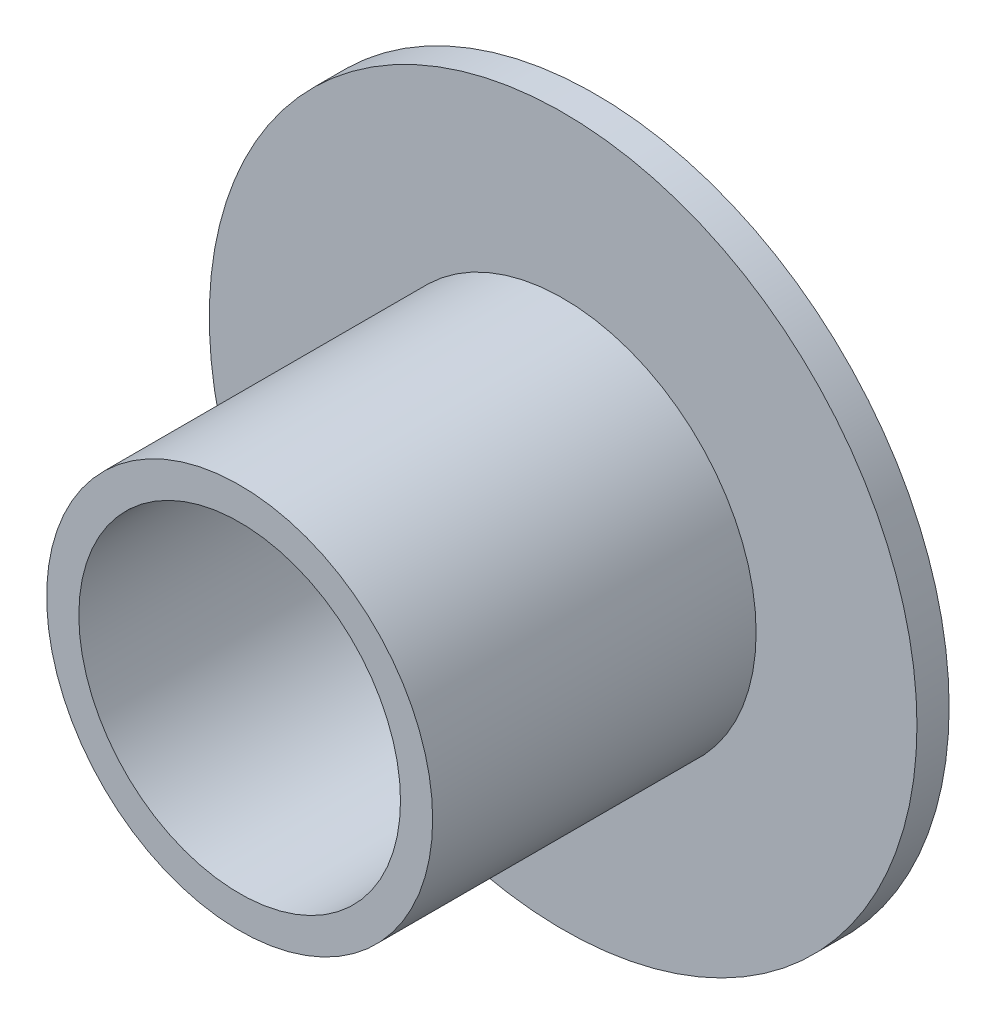
ISO-10303-21;
HEADER;
FILE_DESCRIPTION(('STEP AP214'),'2;1');
FILE_NAME('part.step','',(''),(''),'','','');
FILE_SCHEMA(('AUTOMOTIVE_DESIGN { 1 0 10303 214 1 1 1 1 }'));
ENDSEC;
DATA;
#1=APPLICATION_CONTEXT('core data for automotive mechanical design processes');
#2=APPLICATION_PROTOCOL_DEFINITION('international standard','automotive_design',2000,#1);
#3=PRODUCT_CONTEXT('',#1,'mechanical');
#4=PRODUCT('Part','Part','',(#3));
#5=PRODUCT_RELATED_PRODUCT_CATEGORY('part','',(#4));
#6=PRODUCT_DEFINITION_FORMATION('','',#4);
#7=PRODUCT_DEFINITION_CONTEXT('part definition',#1,'design');
#8=PRODUCT_DEFINITION('design','',#6,#7);
#9=PRODUCT_DEFINITION_SHAPE('','',#8);
#10=(LENGTH_UNIT() NAMED_UNIT(*) SI_UNIT(.MILLI.,.METRE.));
#11=(NAMED_UNIT(*) PLANE_ANGLE_UNIT() SI_UNIT($,.RADIAN.));
#12=(NAMED_UNIT(*) SI_UNIT($,.STERADIAN.) SOLID_ANGLE_UNIT());
#13=UNCERTAINTY_MEASURE_WITH_UNIT(LENGTH_MEASURE(1.E-05),#10,'distance_accuracy_value','');
#14=(GEOMETRIC_REPRESENTATION_CONTEXT(3) GLOBAL_UNCERTAINTY_ASSIGNED_CONTEXT((#13)) GLOBAL_UNIT_ASSIGNED_CONTEXT((#10,
#11,#12)) REPRESENTATION_CONTEXT('',''));
#15=CARTESIAN_POINT('',(0.,0.,0.));
#16=DIRECTION('',(0.,0.,1.));
#17=DIRECTION('',(1.,0.,0.));
#18=AXIS2_PLACEMENT_3D('',#15,#16,#17);
#19=CARTESIAN_POINT('',(0.,0.,0.));
#20=DIRECTION('',(0.,0.,1.));
#21=DIRECTION('',(1.,0.,0.));
#22=AXIS2_PLACEMENT_3D('',#19,#20,#21);
#23=PLANE('',#22);
#24=CARTESIAN_POINT('',(0.,0.,0.));
#25=DIRECTION('',(0.,0.,1.));
#26=DIRECTION('',(1.,0.,0.));
#27=AXIS2_PLACEMENT_3D('',#24,#25,#26);
#28=CIRCLE('',#27,110.);
#29=CARTESIAN_POINT('',(110.,0.,0.));
#30=VERTEX_POINT('',#29);
#31=EDGE_CURVE('E10',#30,#30,#28,.T.);
#32=ORIENTED_EDGE('',*,*,#31,.T.);
#33=EDGE_LOOP('',(#32));
#34=FACE_BOUND('',#33,.T.);
#35=CARTESIAN_POINT('',(0.,0.,0.));
#36=DIRECTION('',(0.,0.,1.));
#37=DIRECTION('',(1.,0.,0.));
#38=AXIS2_PLACEMENT_3D('',#35,#36,#37);
#39=CIRCLE('',#38,60.);
#40=CARTESIAN_POINT('',(60.,0.,0.));
#41=VERTEX_POINT('',#40);
#42=EDGE_CURVE('E55',#41,#41,#39,.T.);
#43=ORIENTED_EDGE('',*,*,#42,.F.);
#44=EDGE_LOOP('',(#43));
#45=FACE_BOUND('',#44,.T.);
#46=ADVANCED_FACE('F39',(#34,#45),#23,.T.);
#47=CARTESIAN_POINT('',(0.,0.,-10.));
#48=DIRECTION('',(0.,0.,1.));
#49=DIRECTION('',(1.,0.,0.));
#50=AXIS2_PLACEMENT_3D('',#47,#48,#49);
#51=PLANE('',#50);
#52=CARTESIAN_POINT('',(0.,0.,-10.));
#53=DIRECTION('',(0.,0.,1.));
#54=DIRECTION('',(1.,0.,0.));
#55=AXIS2_PLACEMENT_3D('',#52,#53,#54);
#56=CIRCLE('',#55,110.);
#57=CARTESIAN_POINT('',(110.,0.,-10.));
#58=VERTEX_POINT('',#57);
#59=EDGE_CURVE('E43',#58,#58,#56,.T.);
#60=ORIENTED_EDGE('',*,*,#59,.F.);
#61=EDGE_LOOP('',(#60));
#62=FACE_BOUND('',#61,.T.);
#63=CARTESIAN_POINT('',(0.,0.,-10.));
#64=DIRECTION('',(0.,0.,1.));
#65=DIRECTION('',(1.,0.,0.));
#66=AXIS2_PLACEMENT_3D('',#63,#64,#65);
#67=CIRCLE('',#66,50.);
#68=CARTESIAN_POINT('',(50.,0.,-10.));
#69=VERTEX_POINT('',#68);
#70=EDGE_CURVE('E50',#69,#69,#67,.T.);
#71=ORIENTED_EDGE('',*,*,#70,.T.);
#72=EDGE_LOOP('',(#71));
#73=FACE_BOUND('',#72,.T.);
#74=ADVANCED_FACE('F81',(#62,#73),#51,.F.);
#75=CARTESIAN_POINT('',(0.,0.,0.));
#76=DIRECTION('',(0.,0.,-1.));
#77=DIRECTION('',(-1.,0.,0.));
#78=AXIS2_PLACEMENT_3D('',#75,#76,#77);
#79=CYLINDRICAL_SURFACE('',#78,110.);
#80=ORIENTED_EDGE('',*,*,#31,.F.);
#81=EDGE_LOOP('',(#80));
#82=FACE_BOUND('',#81,.T.);
#83=ORIENTED_EDGE('',*,*,#59,.T.);
#84=EDGE_LOOP('',(#83));
#85=FACE_BOUND('',#84,.T.);
#86=ADVANCED_FACE('F41',(#82,#85),#79,.T.);
#87=CARTESIAN_POINT('',(0.,0.,0.));
#88=DIRECTION('',(0.,0.,-1.));
#89=DIRECTION('',(-1.,0.,0.));
#90=AXIS2_PLACEMENT_3D('',#87,#88,#89);
#91=CYLINDRICAL_SURFACE('',#90,50.);
#92=ORIENTED_EDGE('',*,*,#70,.F.);
#93=EDGE_LOOP('',(#92));
#94=FACE_BOUND('',#93,.T.);
#95=CARTESIAN_POINT('',(0.,0.,100.55));
#96=DIRECTION('',(0.,0.,1.));
#97=DIRECTION('',(1.,0.,0.));
#98=AXIS2_PLACEMENT_3D('',#95,#96,#97);
#99=CIRCLE('',#98,50.);
#100=CARTESIAN_POINT('',(50.,0.,100.55));
#101=VERTEX_POINT('',#100);
#102=EDGE_CURVE('E58',#101,#101,#99,.T.);
#103=ORIENTED_EDGE('',*,*,#102,.T.);
#104=EDGE_LOOP('',(#103));
#105=FACE_BOUND('',#104,.T.);
#106=ADVANCED_FACE('F64',(#94,#105),#91,.F.);
#107=CARTESIAN_POINT('',(0.,0.,100.55));
#108=DIRECTION('',(0.,0.,1.));
#109=DIRECTION('',(1.,0.,0.));
#110=AXIS2_PLACEMENT_3D('',#107,#108,#109);
#111=PLANE('',#110);
#112=CARTESIAN_POINT('',(0.,0.,100.55));
#113=DIRECTION('',(0.,0.,1.));
#114=DIRECTION('',(1.,0.,0.));
#115=AXIS2_PLACEMENT_3D('',#112,#113,#114);
#116=CIRCLE('',#115,60.);
#117=CARTESIAN_POINT('',(60.,0.,100.55));
#118=VERTEX_POINT('',#117);
#119=EDGE_CURVE('E54',#118,#118,#116,.T.);
#120=ORIENTED_EDGE('',*,*,#119,.T.);
#121=EDGE_LOOP('',(#120));
#122=FACE_BOUND('',#121,.T.);
#123=ORIENTED_EDGE('',*,*,#102,.F.);
#124=EDGE_LOOP('',(#123));
#125=FACE_BOUND('',#124,.T.);
#126=ADVANCED_FACE('F66',(#122,#125),#111,.T.);
#127=CARTESIAN_POINT('',(0.,0.,100.55));
#128=DIRECTION('',(0.,0.,-1.));
#129=DIRECTION('',(-1.,0.,0.));
#130=AXIS2_PLACEMENT_3D('',#127,#128,#129);
#131=CYLINDRICAL_SURFACE('',#130,60.);
#132=ORIENTED_EDGE('',*,*,#119,.F.);
#133=EDGE_LOOP('',(#132));
#134=FACE_BOUND('',#133,.T.);
#135=ORIENTED_EDGE('',*,*,#42,.T.);
#136=EDGE_LOOP('',(#135));
#137=FACE_BOUND('',#136,.T.);
#138=ADVANCED_FACE('F68',(#134,#137),#131,.T.);
#139=CLOSED_SHELL('',(#46,#74,#86,#106,#126,#138));
#140=MANIFOLD_SOLID_BREP('B2',#139);
#141=ADVANCED_BREP_SHAPE_REPRESENTATION('',(#18,#140),#14);
#142=SHAPE_DEFINITION_REPRESENTATION(#9,#141);
ENDSEC;
END-ISO-10303-21;
